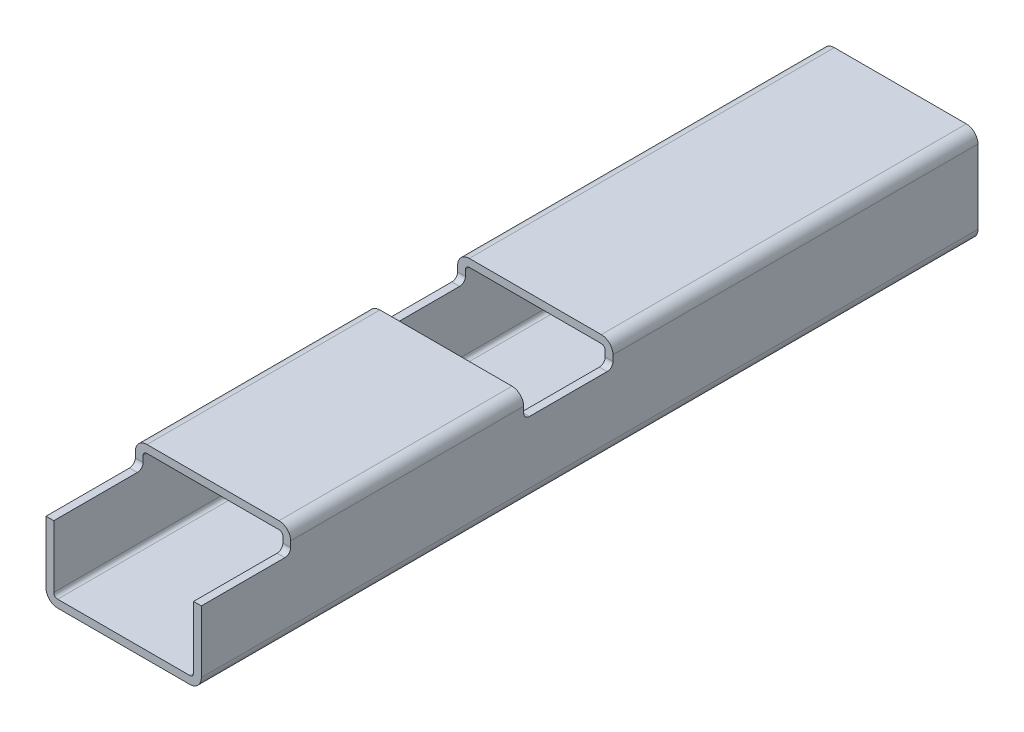
ISO-10303-21;
HEADER;
FILE_DESCRIPTION(('STEP AP214'),'2;1');
FILE_NAME('part.step','',(''),(''),'','','');
FILE_SCHEMA(('AUTOMOTIVE_DESIGN { 1 0 10303 214 1 1 1 1 }'));
ENDSEC;
DATA;
#1=APPLICATION_CONTEXT('core data for automotive mechanical design processes');
#2=APPLICATION_PROTOCOL_DEFINITION('international standard','automotive_design',2000,#1);
#3=PRODUCT_CONTEXT('',#1,'mechanical');
#4=PRODUCT('Part','Part','',(#3));
#5=PRODUCT_RELATED_PRODUCT_CATEGORY('part','',(#4));
#6=PRODUCT_DEFINITION_FORMATION('','',#4);
#7=PRODUCT_DEFINITION_CONTEXT('part definition',#1,'design');
#8=PRODUCT_DEFINITION('design','',#6,#7);
#9=PRODUCT_DEFINITION_SHAPE('','',#8);
#10=(LENGTH_UNIT() NAMED_UNIT(*) SI_UNIT(.MILLI.,.METRE.));
#11=(NAMED_UNIT(*) PLANE_ANGLE_UNIT() SI_UNIT($,.RADIAN.));
#12=(NAMED_UNIT(*) SI_UNIT($,.STERADIAN.) SOLID_ANGLE_UNIT());
#13=UNCERTAINTY_MEASURE_WITH_UNIT(LENGTH_MEASURE(1.E-05),#10,'distance_accuracy_value','');
#14=(GEOMETRIC_REPRESENTATION_CONTEXT(3) GLOBAL_UNCERTAINTY_ASSIGNED_CONTEXT((#13)) GLOBAL_UNIT_ASSIGNED_CONTEXT((#10,
#11,#12)) REPRESENTATION_CONTEXT('',''));
#15=CARTESIAN_POINT('',(0.,0.,0.));
#16=DIRECTION('',(0.,0.,1.));
#17=DIRECTION('',(1.,0.,0.));
#18=AXIS2_PLACEMENT_3D('',#15,#16,#17);
#19=CARTESIAN_POINT('',(34.,19.,400.));
#20=DIRECTION('',(0.,0.,-1.));
#21=DIRECTION('',(-1.,0.,0.));
#22=AXIS2_PLACEMENT_3D('',#19,#20,#21);
#23=CYLINDRICAL_SURFACE('',#22,6.);
#24=DIRECTION('',(0.,0.,-1.));
#25=VECTOR('',#24,1.);
#26=CARTESIAN_POINT('',(34.,25.,400.));
#27=LINE('',#26,#25);
#28=CARTESIAN_POINT('',(34.,25.,188.));
#29=VERTEX_POINT('',#28);
#30=CARTESIAN_POINT('',(34.,25.,0.));
#31=VERTEX_POINT('',#30);
#32=EDGE_CURVE('E339',#29,#31,#27,.T.);
#33=ORIENTED_EDGE('',*,*,#32,.F.);
#34=CARTESIAN_POINT('',(34.,19.,188.));
#35=DIRECTION('',(0.,0.,-1.));
#36=DIRECTION('',(-1.,0.,0.));
#37=AXIS2_PLACEMENT_3D('',#34,#35,#36);
#38=CIRCLE('',#37,6.);
#39=CARTESIAN_POINT('',(40.,19.,188.));
#40=VERTEX_POINT('',#39);
#41=EDGE_CURVE('E520',#29,#40,#38,.T.);
#42=ORIENTED_EDGE('',*,*,#41,.T.);
#43=DIRECTION('',(0.,0.,-1.));
#44=VECTOR('',#43,1.);
#45=CARTESIAN_POINT('',(40.,19.,400.));
#46=LINE('',#45,#44);
#47=CARTESIAN_POINT('',(40.,19.,0.));
#48=VERTEX_POINT('',#47);
#49=EDGE_CURVE('E342',#40,#48,#46,.T.);
#50=ORIENTED_EDGE('',*,*,#49,.T.);
#51=CARTESIAN_POINT('',(34.,19.,0.));
#52=DIRECTION('',(0.,0.,1.));
#53=DIRECTION('',(-1.,0.,0.));
#54=AXIS2_PLACEMENT_3D('',#51,#52,#53);
#55=CIRCLE('',#54,6.);
#56=EDGE_CURVE('E322',#48,#31,#55,.T.);
#57=ORIENTED_EDGE('',*,*,#56,.T.);
#58=EDGE_LOOP('',(#33,#42,#50,#57));
#59=FACE_BOUND('',#58,.T.);
#60=ADVANCED_FACE('F33',(#59),#23,.T.);
#61=CARTESIAN_POINT('',(-34.,25.,400.));
#62=DIRECTION('',(0.,-1.,0.));
#63=DIRECTION('',(0.,0.,-1.));
#64=AXIS2_PLACEMENT_3D('',#61,#62,#63);
#65=PLANE('',#64);
#66=DIRECTION('',(0.,0.,-1.));
#67=VECTOR('',#66,1.);
#68=CARTESIAN_POINT('',(-34.,25.,400.));
#69=LINE('',#68,#67);
#70=CARTESIAN_POINT('',(-34.,25.,188.));
#71=VERTEX_POINT('',#70);
#72=CARTESIAN_POINT('',(-34.,25.,0.));
#73=VERTEX_POINT('',#72);
#74=EDGE_CURVE('E336',#71,#73,#69,.T.);
#75=ORIENTED_EDGE('',*,*,#74,.F.);
#76=DIRECTION('',(1.,0.,0.));
#77=VECTOR('',#76,1.);
#78=CARTESIAN_POINT('',(-40.,25.,188.));
#79=LINE('',#78,#77);
#80=EDGE_CURVE('E461',#71,#29,#79,.T.);
#81=ORIENTED_EDGE('',*,*,#80,.T.);
#82=ORIENTED_EDGE('',*,*,#32,.T.);
#83=DIRECTION('',(-1.,0.,0.));
#84=VECTOR('',#83,1.);
#85=CARTESIAN_POINT('',(-34.,25.,0.));
#86=LINE('',#85,#84);
#87=EDGE_CURVE('E325',#31,#73,#86,.T.);
#88=ORIENTED_EDGE('',*,*,#87,.T.);
#89=EDGE_LOOP('',(#75,#81,#82,#88));
#90=FACE_BOUND('',#89,.T.);
#91=ADVANCED_FACE('F684',(#90),#65,.F.);
#92=CARTESIAN_POINT('',(-34.,19.,400.));
#93=DIRECTION('',(0.,0.,-1.));
#94=DIRECTION('',(-1.,0.,0.));
#95=AXIS2_PLACEMENT_3D('',#92,#93,#94);
#96=CYLINDRICAL_SURFACE('',#95,6.);
#97=DIRECTION('',(0.,0.,-1.));
#98=VECTOR('',#97,1.);
#99=CARTESIAN_POINT('',(-40.,19.,400.));
#100=LINE('',#99,#98);
#101=CARTESIAN_POINT('',(-40.,19.,188.));
#102=VERTEX_POINT('',#101);
#103=CARTESIAN_POINT('',(-40.,19.,0.));
#104=VERTEX_POINT('',#103);
#105=EDGE_CURVE('E305',#102,#104,#100,.T.);
#106=ORIENTED_EDGE('',*,*,#105,.F.);
#107=CARTESIAN_POINT('',(-34.,19.,188.));
#108=DIRECTION('',(0.,0.,-1.));
#109=DIRECTION('',(-1.,0.,0.));
#110=AXIS2_PLACEMENT_3D('',#107,#108,#109);
#111=CIRCLE('',#110,6.);
#112=EDGE_CURVE('E517',#102,#71,#111,.T.);
#113=ORIENTED_EDGE('',*,*,#112,.T.);
#114=ORIENTED_EDGE('',*,*,#74,.T.);
#115=CARTESIAN_POINT('',(-34.,19.,0.));
#116=DIRECTION('',(0.,0.,1.));
#117=DIRECTION('',(-1.,0.,0.));
#118=AXIS2_PLACEMENT_3D('',#115,#116,#117);
#119=CIRCLE('',#118,6.);
#120=EDGE_CURVE('E328',#73,#104,#119,.T.);
#121=ORIENTED_EDGE('',*,*,#120,.T.);
#122=EDGE_LOOP('',(#106,#113,#114,#121));
#123=FACE_BOUND('',#122,.T.);
#124=ADVANCED_FACE('F690',(#123),#96,.T.);
#125=CARTESIAN_POINT('',(34.,19.,400.));
#126=DIRECTION('',(0.,0.,-1.));
#127=DIRECTION('',(-1.,0.,0.));
#128=AXIS2_PLACEMENT_3D('',#125,#126,#127);
#129=CYLINDRICAL_SURFACE('',#128,2.);
#130=CARTESIAN_POINT('',(34.,19.,188.));
#131=DIRECTION('',(0.,0.,-1.));
#132=DIRECTION('',(-1.,0.,0.));
#133=AXIS2_PLACEMENT_3D('',#130,#131,#132);
#134=CIRCLE('',#133,2.);
#135=CARTESIAN_POINT('',(34.,21.,188.));
#136=VERTEX_POINT('',#135);
#137=CARTESIAN_POINT('',(36.,19.,188.));
#138=VERTEX_POINT('',#137);
#139=EDGE_CURVE('E513',#136,#138,#134,.T.);
#140=ORIENTED_EDGE('',*,*,#139,.F.);
#141=DIRECTION('',(0.,0.,-1.));
#142=VECTOR('',#141,1.);
#143=CARTESIAN_POINT('',(34.,21.,400.));
#144=LINE('',#143,#142);
#145=CARTESIAN_POINT('',(34.,21.,0.));
#146=VERTEX_POINT('',#145);
#147=EDGE_CURVE('E398',#136,#146,#144,.T.);
#148=ORIENTED_EDGE('',*,*,#147,.T.);
#149=CARTESIAN_POINT('',(34.,19.,0.));
#150=DIRECTION('',(0.,0.,1.));
#151=DIRECTION('',(-1.,0.,0.));
#152=AXIS2_PLACEMENT_3D('',#149,#150,#151);
#153=CIRCLE('',#152,2.);
#154=CARTESIAN_POINT('',(36.,19.,0.));
#155=VERTEX_POINT('',#154);
#156=EDGE_CURVE('E564',#155,#146,#153,.T.);
#157=ORIENTED_EDGE('',*,*,#156,.F.);
#158=DIRECTION('',(0.,0.,-1.));
#159=VECTOR('',#158,1.);
#160=CARTESIAN_POINT('',(36.,19.,400.));
#161=LINE('',#160,#159);
#162=EDGE_CURVE('E401',#138,#155,#161,.T.);
#163=ORIENTED_EDGE('',*,*,#162,.F.);
#164=EDGE_LOOP('',(#140,#148,#157,#163));
#165=FACE_BOUND('',#164,.T.);
#166=ADVANCED_FACE('F604',(#165),#129,.F.);
#167=CARTESIAN_POINT('',(-34.,21.,400.));
#168=DIRECTION('',(0.,-1.,0.));
#169=DIRECTION('',(1.,0.,0.));
#170=AXIS2_PLACEMENT_3D('',#167,#168,#169);
#171=PLANE('',#170);
#172=DIRECTION('',(1.,0.,0.));
#173=VECTOR('',#172,1.);
#174=CARTESIAN_POINT('',(-34.,21.,188.));
#175=LINE('',#174,#173);
#176=CARTESIAN_POINT('',(-34.,21.,188.));
#177=VERTEX_POINT('',#176);
#178=EDGE_CURVE('E511',#177,#136,#175,.T.);
#179=ORIENTED_EDGE('',*,*,#178,.F.);
#180=DIRECTION('',(0.,0.,-1.));
#181=VECTOR('',#180,1.);
#182=CARTESIAN_POINT('',(-34.,21.,400.));
#183=LINE('',#182,#181);
#184=CARTESIAN_POINT('',(-34.,21.,0.));
#185=VERTEX_POINT('',#184);
#186=EDGE_CURVE('E389',#177,#185,#183,.T.);
#187=ORIENTED_EDGE('',*,*,#186,.T.);
#188=DIRECTION('',(-1.,0.,0.));
#189=VECTOR('',#188,1.);
#190=CARTESIAN_POINT('',(-34.,21.,0.));
#191=LINE('',#190,#189);
#192=EDGE_CURVE('E567',#146,#185,#191,.T.);
#193=ORIENTED_EDGE('',*,*,#192,.F.);
#194=ORIENTED_EDGE('',*,*,#147,.F.);
#195=EDGE_LOOP('',(#179,#187,#193,#194));
#196=FACE_BOUND('',#195,.T.);
#197=ADVANCED_FACE('F609',(#196),#171,.T.);
#198=CARTESIAN_POINT('',(-34.,19.,400.));
#199=DIRECTION('',(0.,0.,-1.));
#200=DIRECTION('',(-1.,0.,0.));
#201=AXIS2_PLACEMENT_3D('',#198,#199,#200);
#202=CYLINDRICAL_SURFACE('',#201,2.);
#203=CARTESIAN_POINT('',(-34.,19.,188.));
#204=DIRECTION('',(0.,0.,-1.));
#205=DIRECTION('',(-1.,0.,0.));
#206=AXIS2_PLACEMENT_3D('',#203,#204,#205);
#207=CIRCLE('',#206,2.);
#208=CARTESIAN_POINT('',(-36.,19.,188.));
#209=VERTEX_POINT('',#208);
#210=EDGE_CURVE('E509',#209,#177,#207,.T.);
#211=ORIENTED_EDGE('',*,*,#210,.F.);
#212=DIRECTION('',(0.,0.,-1.));
#213=VECTOR('',#212,1.);
#214=CARTESIAN_POINT('',(-36.,19.,400.));
#215=LINE('',#214,#213);
#216=CARTESIAN_POINT('',(-36.,19.,0.));
#217=VERTEX_POINT('',#216);
#218=EDGE_CURVE('E390',#209,#217,#215,.T.);
#219=ORIENTED_EDGE('',*,*,#218,.T.);
#220=CARTESIAN_POINT('',(-34.,19.,0.));
#221=DIRECTION('',(0.,0.,1.));
#222=DIRECTION('',(-1.,0.,0.));
#223=AXIS2_PLACEMENT_3D('',#220,#221,#222);
#224=CIRCLE('',#223,2.);
#225=EDGE_CURVE('E570',#185,#217,#224,.T.);
#226=ORIENTED_EDGE('',*,*,#225,.F.);
#227=ORIENTED_EDGE('',*,*,#186,.F.);
#228=EDGE_LOOP('',(#211,#219,#226,#227));
#229=FACE_BOUND('',#228,.T.);
#230=ADVANCED_FACE('F613',(#229),#202,.F.);
#231=CARTESIAN_POINT('',(-34.,-19.,400.));
#232=DIRECTION('',(0.,0.,-1.));
#233=DIRECTION('',(-1.,0.,0.));
#234=AXIS2_PLACEMENT_3D('',#231,#232,#233);
#235=PLANE('',#234);
#236=DIRECTION('',(0.,1.,0.));
#237=VECTOR('',#236,1.);
#238=CARTESIAN_POINT('',(40.,-19.,400.));
#239=LINE('',#238,#237);
#240=CARTESIAN_POINT('',(40.,-19.,400.));
#241=VERTEX_POINT('',#240);
#242=CARTESIAN_POINT('',(40.,13.,400.));
#243=VERTEX_POINT('',#242);
#244=EDGE_CURVE('E303',#241,#243,#239,.T.);
#245=ORIENTED_EDGE('',*,*,#244,.T.);
#246=DIRECTION('',(1.,0.,0.));
#247=VECTOR('',#246,1.);
#248=CARTESIAN_POINT('',(-40.,13.,400.));
#249=LINE('',#248,#247);
#250=CARTESIAN_POINT('',(36.,13.,400.));
#251=VERTEX_POINT('',#250);
#252=EDGE_CURVE('E297',#251,#243,#249,.T.);
#253=ORIENTED_EDGE('',*,*,#252,.F.);
#254=DIRECTION('',(0.,1.,0.));
#255=VECTOR('',#254,1.);
#256=CARTESIAN_POINT('',(36.,-19.,400.));
#257=LINE('',#256,#255);
#258=CARTESIAN_POINT('',(36.,-19.,400.));
#259=VERTEX_POINT('',#258);
#260=EDGE_CURVE('E549',#259,#251,#257,.T.);
#261=ORIENTED_EDGE('',*,*,#260,.F.);
#262=CARTESIAN_POINT('',(34.,-19.,400.));
#263=DIRECTION('',(0.,0.,1.));
#264=DIRECTION('',(1.,0.,0.));
#265=AXIS2_PLACEMENT_3D('',#262,#263,#264);
#266=CIRCLE('',#265,2.);
#267=CARTESIAN_POINT('',(34.,-21.,400.));
#268=VERTEX_POINT('',#267);
#269=EDGE_CURVE('E547',#268,#259,#266,.T.);
#270=ORIENTED_EDGE('',*,*,#269,.F.);
#271=DIRECTION('',(1.,0.,0.));
#272=VECTOR('',#271,1.);
#273=CARTESIAN_POINT('',(-34.,-21.,400.));
#274=LINE('',#273,#272);
#275=CARTESIAN_POINT('',(-34.,-21.,400.));
#276=VERTEX_POINT('',#275);
#277=EDGE_CURVE('E544',#276,#268,#274,.T.);
#278=ORIENTED_EDGE('',*,*,#277,.F.);
#279=CARTESIAN_POINT('',(-34.,-19.,400.));
#280=DIRECTION('',(0.,0.,1.));
#281=DIRECTION('',(-1.,0.,0.));
#282=AXIS2_PLACEMENT_3D('',#279,#280,#281);
#283=CIRCLE('',#282,2.);
#284=CARTESIAN_POINT('',(-36.,-19.,400.));
#285=VERTEX_POINT('',#284);
#286=EDGE_CURVE('E542',#285,#276,#283,.T.);
#287=ORIENTED_EDGE('',*,*,#286,.F.);
#288=DIRECTION('',(0.,-1.,0.));
#289=VECTOR('',#288,1.);
#290=CARTESIAN_POINT('',(-36.,-19.,400.));
#291=LINE('',#290,#289);
#292=CARTESIAN_POINT('',(-36.,13.,400.));
#293=VERTEX_POINT('',#292);
#294=EDGE_CURVE('E295',#293,#285,#291,.T.);
#295=ORIENTED_EDGE('',*,*,#294,.F.);
#296=CARTESIAN_POINT('',(-40.,13.,400.));
#297=VERTEX_POINT('',#296);
#298=EDGE_CURVE('E56',#297,#293,#249,.T.);
#299=ORIENTED_EDGE('',*,*,#298,.F.);
#300=DIRECTION('',(0.,-1.,0.));
#301=VECTOR('',#300,1.);
#302=CARTESIAN_POINT('',(-40.,-19.,400.));
#303=LINE('',#302,#301);
#304=CARTESIAN_POINT('',(-40.,-19.,400.));
#305=VERTEX_POINT('',#304);
#306=EDGE_CURVE('E292',#297,#305,#303,.T.);
#307=ORIENTED_EDGE('',*,*,#306,.T.);
#308=CARTESIAN_POINT('',(-34.,-19.,400.));
#309=DIRECTION('',(0.,0.,1.));
#310=DIRECTION('',(-1.,0.,0.));
#311=AXIS2_PLACEMENT_3D('',#308,#309,#310);
#312=CIRCLE('',#311,6.);
#313=CARTESIAN_POINT('',(-34.,-25.,400.));
#314=VERTEX_POINT('',#313);
#315=EDGE_CURVE('E332',#305,#314,#312,.T.);
#316=ORIENTED_EDGE('',*,*,#315,.T.);
#317=DIRECTION('',(1.,0.,0.));
#318=VECTOR('',#317,1.);
#319=CARTESIAN_POINT('',(-34.,-25.,400.));
#320=LINE('',#319,#318);
#321=CARTESIAN_POINT('',(34.,-25.,400.));
#322=VERTEX_POINT('',#321);
#323=EDGE_CURVE('E411',#314,#322,#320,.T.);
#324=ORIENTED_EDGE('',*,*,#323,.T.);
#325=CARTESIAN_POINT('',(34.,-19.,400.));
#326=DIRECTION('',(0.,0.,1.));
#327=DIRECTION('',(1.,0.,0.));
#328=AXIS2_PLACEMENT_3D('',#325,#326,#327);
#329=CIRCLE('',#328,6.);
#330=EDGE_CURVE('E307',#322,#241,#329,.T.);
#331=ORIENTED_EDGE('',*,*,#330,.T.);
#332=EDGE_LOOP('',(#245,#253,#261,#270,#278,#287,#295,#299,#307,#316,#324,#331));
#333=FACE_BOUND('',#332,.T.);
#334=ADVANCED_FACE('F290',(#333),#235,.F.);
#335=CARTESIAN_POINT('',(-34.,-19.,0.));
#336=DIRECTION('',(0.,0.,-1.));
#337=DIRECTION('',(-1.,0.,0.));
#338=AXIS2_PLACEMENT_3D('',#335,#336,#337);
#339=PLANE('',#338);
#340=CARTESIAN_POINT('',(-34.,-19.,0.));
#341=DIRECTION('',(0.,0.,1.));
#342=DIRECTION('',(-1.,0.,0.));
#343=AXIS2_PLACEMENT_3D('',#340,#341,#342);
#344=CIRCLE('',#343,6.);
#345=CARTESIAN_POINT('',(-40.,-19.,0.));
#346=VERTEX_POINT('',#345);
#347=CARTESIAN_POINT('',(-34.,-25.,0.));
#348=VERTEX_POINT('',#347);
#349=EDGE_CURVE('E311',#346,#348,#344,.T.);
#350=ORIENTED_EDGE('',*,*,#349,.F.);
#351=DIRECTION('',(0.,-1.,0.));
#352=VECTOR('',#351,1.);
#353=CARTESIAN_POINT('',(-40.,-19.,0.));
#354=LINE('',#353,#352);
#355=EDGE_CURVE('E331',#104,#346,#354,.T.);
#356=ORIENTED_EDGE('',*,*,#355,.F.);
#357=ORIENTED_EDGE('',*,*,#120,.F.);
#358=ORIENTED_EDGE('',*,*,#87,.F.);
#359=ORIENTED_EDGE('',*,*,#56,.F.);
#360=DIRECTION('',(0.,1.,0.));
#361=VECTOR('',#360,1.);
#362=CARTESIAN_POINT('',(40.,-19.,0.));
#363=LINE('',#362,#361);
#364=CARTESIAN_POINT('',(40.,-19.,0.));
#365=VERTEX_POINT('',#364);
#366=EDGE_CURVE('E319',#365,#48,#363,.T.);
#367=ORIENTED_EDGE('',*,*,#366,.F.);
#368=CARTESIAN_POINT('',(34.,-19.,0.));
#369=DIRECTION('',(0.,0.,1.));
#370=DIRECTION('',(1.,0.,0.));
#371=AXIS2_PLACEMENT_3D('',#368,#369,#370);
#372=CIRCLE('',#371,6.);
#373=CARTESIAN_POINT('',(34.,-25.,0.));
#374=VERTEX_POINT('',#373);
#375=EDGE_CURVE('E317',#374,#365,#372,.T.);
#376=ORIENTED_EDGE('',*,*,#375,.F.);
#377=DIRECTION('',(1.,0.,0.));
#378=VECTOR('',#377,1.);
#379=CARTESIAN_POINT('',(-34.,-25.,0.));
#380=LINE('',#379,#378);
#381=EDGE_CURVE('E314',#348,#374,#380,.T.);
#382=ORIENTED_EDGE('',*,*,#381,.F.);
#383=EDGE_LOOP('',(#350,#356,#357,#358,#359,#367,#376,#382));
#384=FACE_BOUND('',#383,.T.);
#385=DIRECTION('',(0.,-1.,0.));
#386=VECTOR('',#385,1.);
#387=CARTESIAN_POINT('',(-36.,-19.,0.));
#388=LINE('',#387,#386);
#389=CARTESIAN_POINT('',(-36.,-19.,0.));
#390=VERTEX_POINT('',#389);
#391=EDGE_CURVE('E545',#217,#390,#388,.T.);
#392=ORIENTED_EDGE('',*,*,#391,.T.);
#393=CARTESIAN_POINT('',(-34.,-19.,0.));
#394=DIRECTION('',(0.,0.,1.));
#395=DIRECTION('',(-1.,0.,0.));
#396=AXIS2_PLACEMENT_3D('',#393,#394,#395);
#397=CIRCLE('',#396,2.);
#398=CARTESIAN_POINT('',(-34.,-21.,0.));
#399=VERTEX_POINT('',#398);
#400=EDGE_CURVE('E541',#390,#399,#397,.T.);
#401=ORIENTED_EDGE('',*,*,#400,.T.);
#402=DIRECTION('',(1.,0.,0.));
#403=VECTOR('',#402,1.);
#404=CARTESIAN_POINT('',(-34.,-21.,0.));
#405=LINE('',#404,#403);
#406=CARTESIAN_POINT('',(34.,-21.,0.));
#407=VERTEX_POINT('',#406);
#408=EDGE_CURVE('E555',#399,#407,#405,.T.);
#409=ORIENTED_EDGE('',*,*,#408,.T.);
#410=CARTESIAN_POINT('',(34.,-19.,0.));
#411=DIRECTION('',(0.,0.,1.));
#412=DIRECTION('',(1.,0.,0.));
#413=AXIS2_PLACEMENT_3D('',#410,#411,#412);
#414=CIRCLE('',#413,2.);
#415=CARTESIAN_POINT('',(36.,-19.,0.));
#416=VERTEX_POINT('',#415);
#417=EDGE_CURVE('E558',#407,#416,#414,.T.);
#418=ORIENTED_EDGE('',*,*,#417,.T.);
#419=DIRECTION('',(0.,1.,0.));
#420=VECTOR('',#419,1.);
#421=CARTESIAN_POINT('',(36.,-19.,0.));
#422=LINE('',#421,#420);
#423=EDGE_CURVE('E561',#416,#155,#422,.T.);
#424=ORIENTED_EDGE('',*,*,#423,.T.);
#425=ORIENTED_EDGE('',*,*,#156,.T.);
#426=ORIENTED_EDGE('',*,*,#192,.T.);
#427=ORIENTED_EDGE('',*,*,#225,.T.);
#428=EDGE_LOOP('',(#392,#401,#409,#418,#424,#425,#426,#427));
#429=FACE_BOUND('',#428,.T.);
#430=ADVANCED_FACE('F575',(#384,#429),#339,.T.);
#431=CARTESIAN_POINT('',(-34.,-19.,400.));
#432=DIRECTION('',(0.,0.,-1.));
#433=DIRECTION('',(-1.,0.,0.));
#434=AXIS2_PLACEMENT_3D('',#431,#432,#433);
#435=CYLINDRICAL_SURFACE('',#434,6.);
#436=ORIENTED_EDGE('',*,*,#349,.T.);
#437=DIRECTION('',(0.,0.,-1.));
#438=VECTOR('',#437,1.);
#439=CARTESIAN_POINT('',(-34.,-25.,400.));
#440=LINE('',#439,#438);
#441=EDGE_CURVE('E351',#314,#348,#440,.T.);
#442=ORIENTED_EDGE('',*,*,#441,.F.);
#443=ORIENTED_EDGE('',*,*,#315,.F.);
#444=DIRECTION('',(0.,0.,-1.));
#445=VECTOR('',#444,1.);
#446=CARTESIAN_POINT('',(-40.,-19.,400.));
#447=LINE('',#446,#445);
#448=EDGE_CURVE('E301',#305,#346,#447,.T.);
#449=ORIENTED_EDGE('',*,*,#448,.T.);
#450=EDGE_LOOP('',(#436,#442,#443,#449));
#451=FACE_BOUND('',#450,.T.);
#452=ADVANCED_FACE('F35',(#451),#435,.T.);
#453=CARTESIAN_POINT('',(-34.,-25.,400.));
#454=DIRECTION('',(0.,1.,0.));
#455=DIRECTION('',(0.,0.,1.));
#456=AXIS2_PLACEMENT_3D('',#453,#454,#455);
#457=PLANE('',#456);
#458=ORIENTED_EDGE('',*,*,#381,.T.);
#459=DIRECTION('',(0.,0.,-1.));
#460=VECTOR('',#459,1.);
#461=CARTESIAN_POINT('',(34.,-25.,400.));
#462=LINE('',#461,#460);
#463=EDGE_CURVE('E348',#322,#374,#462,.T.);
#464=ORIENTED_EDGE('',*,*,#463,.F.);
#465=ORIENTED_EDGE('',*,*,#323,.F.);
#466=ORIENTED_EDGE('',*,*,#441,.T.);
#467=EDGE_LOOP('',(#458,#464,#465,#466));
#468=FACE_BOUND('',#467,.T.);
#469=ADVANCED_FACE('F703',(#468),#457,.F.);
#470=CARTESIAN_POINT('',(34.,-19.,400.));
#471=DIRECTION('',(0.,0.,-1.));
#472=DIRECTION('',(-1.,0.,0.));
#473=AXIS2_PLACEMENT_3D('',#470,#471,#472);
#474=CYLINDRICAL_SURFACE('',#473,6.);
#475=ORIENTED_EDGE('',*,*,#375,.T.);
#476=DIRECTION('',(0.,0.,-1.));
#477=VECTOR('',#476,1.);
#478=CARTESIAN_POINT('',(40.,-19.,400.));
#479=LINE('',#478,#477);
#480=EDGE_CURVE('E345',#241,#365,#479,.T.);
#481=ORIENTED_EDGE('',*,*,#480,.F.);
#482=ORIENTED_EDGE('',*,*,#330,.F.);
#483=ORIENTED_EDGE('',*,*,#463,.T.);
#484=EDGE_LOOP('',(#475,#481,#482,#483));
#485=FACE_BOUND('',#484,.T.);
#486=ADVANCED_FACE('F418',(#485),#474,.T.);
#487=CARTESIAN_POINT('',(40.,-19.,400.));
#488=DIRECTION('',(-1.,0.,0.));
#489=DIRECTION('',(0.,0.,1.));
#490=AXIS2_PLACEMENT_3D('',#487,#488,#489);
#491=PLANE('',#490);
#492=CARTESIAN_POINT('',(40.,19.,354.));
#493=VERTEX_POINT('',#492);
#494=CARTESIAN_POINT('',(40.,19.,234.));
#495=VERTEX_POINT('',#494);
#496=EDGE_CURVE('E344',#493,#495,#46,.T.);
#497=ORIENTED_EDGE('',*,*,#496,.F.);
#498=DIRECTION('',(0.,1.,0.));
#499=VECTOR('',#498,1.);
#500=CARTESIAN_POINT('',(40.,16.,354.));
#501=LINE('',#500,#499);
#502=CARTESIAN_POINT('',(40.,16.,354.));
#503=VERTEX_POINT('',#502);
#504=EDGE_CURVE('E285',#503,#493,#501,.T.);
#505=ORIENTED_EDGE('',*,*,#504,.F.);
#506=CARTESIAN_POINT('',(40.,16.,357.));
#507=DIRECTION('',(1.,0.,0.));
#508=DIRECTION('',(0.,0.,-1.));
#509=AXIS2_PLACEMENT_3D('',#506,#507,#508);
#510=CIRCLE('',#509,3.);
#511=CARTESIAN_POINT('',(40.,13.,357.));
#512=VERTEX_POINT('',#511);
#513=EDGE_CURVE('E430',#512,#503,#510,.T.);
#514=ORIENTED_EDGE('',*,*,#513,.F.);
#515=DIRECTION('',(0.,0.,-1.));
#516=VECTOR('',#515,1.);
#517=CARTESIAN_POINT('',(40.,13.,400.));
#518=LINE('',#517,#516);
#519=EDGE_CURVE('E427',#243,#512,#518,.T.);
#520=ORIENTED_EDGE('',*,*,#519,.F.);
#521=ORIENTED_EDGE('',*,*,#244,.F.);
#522=ORIENTED_EDGE('',*,*,#480,.T.);
#523=ORIENTED_EDGE('',*,*,#366,.T.);
#524=ORIENTED_EDGE('',*,*,#49,.F.);
#525=DIRECTION('',(0.,1.,0.));
#526=VECTOR('',#525,1.);
#527=CARTESIAN_POINT('',(40.,16.,188.));
#528=LINE('',#527,#526);
#529=CARTESIAN_POINT('',(40.,16.,188.));
#530=VERTEX_POINT('',#529);
#531=EDGE_CURVE('E462',#530,#40,#528,.T.);
#532=ORIENTED_EDGE('',*,*,#531,.F.);
#533=CARTESIAN_POINT('',(40.,16.,191.));
#534=DIRECTION('',(1.,0.,0.));
#535=DIRECTION('',(0.,0.,-1.));
#536=AXIS2_PLACEMENT_3D('',#533,#534,#535);
#537=CIRCLE('',#536,3.);
#538=CARTESIAN_POINT('',(40.,13.,191.));
#539=VERTEX_POINT('',#538);
#540=EDGE_CURVE('E451',#539,#530,#537,.T.);
#541=ORIENTED_EDGE('',*,*,#540,.F.);
#542=DIRECTION('',(0.,0.,-1.));
#543=VECTOR('',#542,1.);
#544=CARTESIAN_POINT('',(40.,13.,231.));
#545=LINE('',#544,#543);
#546=CARTESIAN_POINT('',(40.,13.,231.));
#547=VERTEX_POINT('',#546);
#548=EDGE_CURVE('E470',#547,#539,#545,.T.);
#549=ORIENTED_EDGE('',*,*,#548,.F.);
#550=CARTESIAN_POINT('',(40.,16.,231.));
#551=DIRECTION('',(1.,0.,0.));
#552=DIRECTION('',(0.,0.,1.));
#553=AXIS2_PLACEMENT_3D('',#550,#551,#552);
#554=CIRCLE('',#553,3.);
#555=CARTESIAN_POINT('',(40.,16.,234.));
#556=VERTEX_POINT('',#555);
#557=EDGE_CURVE('E467',#556,#547,#554,.T.);
#558=ORIENTED_EDGE('',*,*,#557,.F.);
#559=DIRECTION('',(0.,-1.,0.));
#560=VECTOR('',#559,1.);
#561=CARTESIAN_POINT('',(40.,16.,234.));
#562=LINE('',#561,#560);
#563=EDGE_CURVE('E464',#495,#556,#562,.T.);
#564=ORIENTED_EDGE('',*,*,#563,.F.);
#565=EDGE_LOOP('',(#497,#505,#514,#520,#521,#522,#523,#524,#532,#541,#549,#558,#564));
#566=FACE_BOUND('',#565,.T.);
#567=ADVANCED_FACE('F424',(#566),#491,.F.);
#568=CARTESIAN_POINT('',(34.,25.,354.));
#569=VERTEX_POINT('',#568);
#570=CARTESIAN_POINT('',(34.,25.,234.));
#571=VERTEX_POINT('',#570);
#572=EDGE_CURVE('E341',#569,#571,#27,.T.);
#573=ORIENTED_EDGE('',*,*,#572,.F.);
#574=CARTESIAN_POINT('',(34.,19.,354.));
#575=DIRECTION('',(0.,0.,-1.));
#576=DIRECTION('',(-1.,0.,0.));
#577=AXIS2_PLACEMENT_3D('',#574,#575,#576);
#578=CIRCLE('',#577,6.);
#579=EDGE_CURVE('E538',#569,#493,#578,.T.);
#580=ORIENTED_EDGE('',*,*,#579,.T.);
#581=ORIENTED_EDGE('',*,*,#496,.T.);
#582=CARTESIAN_POINT('',(34.,19.,234.));
#583=DIRECTION('',(0.,0.,1.));
#584=DIRECTION('',(1.,0.,0.));
#585=AXIS2_PLACEMENT_3D('',#582,#583,#584);
#586=CIRCLE('',#585,6.);
#587=EDGE_CURVE('E500',#495,#571,#586,.T.);
#588=ORIENTED_EDGE('',*,*,#587,.T.);
#589=EDGE_LOOP('',(#573,#580,#581,#588));
#590=FACE_BOUND('',#589,.T.);
#591=ADVANCED_FACE('F640',(#590),#23,.T.);
#592=CARTESIAN_POINT('',(-34.,25.,354.));
#593=VERTEX_POINT('',#592);
#594=CARTESIAN_POINT('',(-34.,25.,234.));
#595=VERTEX_POINT('',#594);
#596=EDGE_CURVE('E338',#593,#595,#69,.T.);
#597=ORIENTED_EDGE('',*,*,#596,.F.);
#598=DIRECTION('',(1.,0.,0.));
#599=VECTOR('',#598,1.);
#600=CARTESIAN_POINT('',(-40.,25.,354.));
#601=LINE('',#600,#599);
#602=EDGE_CURVE('E378',#593,#569,#601,.T.);
#603=ORIENTED_EDGE('',*,*,#602,.T.);
#604=ORIENTED_EDGE('',*,*,#572,.T.);
#605=DIRECTION('',(1.,0.,0.));
#606=VECTOR('',#605,1.);
#607=CARTESIAN_POINT('',(-40.,25.,234.));
#608=LINE('',#607,#606);
#609=EDGE_CURVE('E486',#595,#571,#608,.T.);
#610=ORIENTED_EDGE('',*,*,#609,.F.);
#611=EDGE_LOOP('',(#597,#603,#604,#610));
#612=FACE_BOUND('',#611,.T.);
#613=ADVANCED_FACE('F637',(#612),#65,.F.);
#614=CARTESIAN_POINT('',(-40.,19.,354.));
#615=VERTEX_POINT('',#614);
#616=CARTESIAN_POINT('',(-40.,19.,234.));
#617=VERTEX_POINT('',#616);
#618=EDGE_CURVE('E335',#615,#617,#100,.T.);
#619=ORIENTED_EDGE('',*,*,#618,.F.);
#620=CARTESIAN_POINT('',(-34.,19.,354.));
#621=DIRECTION('',(0.,0.,-1.));
#622=DIRECTION('',(-1.,0.,0.));
#623=AXIS2_PLACEMENT_3D('',#620,#621,#622);
#624=CIRCLE('',#623,6.);
#625=EDGE_CURVE('E535',#615,#593,#624,.T.);
#626=ORIENTED_EDGE('',*,*,#625,.T.);
#627=ORIENTED_EDGE('',*,*,#596,.T.);
#628=CARTESIAN_POINT('',(-34.,19.,234.));
#629=DIRECTION('',(0.,0.,1.));
#630=DIRECTION('',(1.,0.,0.));
#631=AXIS2_PLACEMENT_3D('',#628,#629,#630);
#632=CIRCLE('',#631,6.);
#633=EDGE_CURVE('E497',#595,#617,#632,.T.);
#634=ORIENTED_EDGE('',*,*,#633,.T.);
#635=EDGE_LOOP('',(#619,#626,#627,#634));
#636=FACE_BOUND('',#635,.T.);
#637=ADVANCED_FACE('F631',(#636),#96,.T.);
#638=CARTESIAN_POINT('',(-40.,-19.,400.));
#639=DIRECTION('',(1.,0.,0.));
#640=DIRECTION('',(0.,0.,-1.));
#641=AXIS2_PLACEMENT_3D('',#638,#639,#640);
#642=PLANE('',#641);
#643=CARTESIAN_POINT('',(-40.,16.,357.));
#644=DIRECTION('',(1.,0.,0.));
#645=DIRECTION('',(0.,0.,-1.));
#646=AXIS2_PLACEMENT_3D('',#643,#644,#645);
#647=CIRCLE('',#646,3.);
#648=CARTESIAN_POINT('',(-40.,13.,357.));
#649=VERTEX_POINT('',#648);
#650=CARTESIAN_POINT('',(-40.,16.,354.));
#651=VERTEX_POINT('',#650);
#652=EDGE_CURVE('E284',#649,#651,#647,.T.);
#653=ORIENTED_EDGE('',*,*,#652,.T.);
#654=DIRECTION('',(0.,1.,0.));
#655=VECTOR('',#654,1.);
#656=CARTESIAN_POINT('',(-40.,16.,354.));
#657=LINE('',#656,#655);
#658=EDGE_CURVE('E377',#651,#615,#657,.T.);
#659=ORIENTED_EDGE('',*,*,#658,.T.);
#660=ORIENTED_EDGE('',*,*,#618,.T.);
#661=DIRECTION('',(0.,-1.,0.));
#662=VECTOR('',#661,1.);
#663=CARTESIAN_POINT('',(-40.,16.,234.));
#664=LINE('',#663,#662);
#665=CARTESIAN_POINT('',(-40.,16.,234.));
#666=VERTEX_POINT('',#665);
#667=EDGE_CURVE('E450',#617,#666,#664,.T.);
#668=ORIENTED_EDGE('',*,*,#667,.T.);
#669=CARTESIAN_POINT('',(-40.,16.,231.));
#670=DIRECTION('',(1.,0.,0.));
#671=DIRECTION('',(0.,0.,1.));
#672=AXIS2_PLACEMENT_3D('',#669,#670,#671);
#673=CIRCLE('',#672,3.);
#674=CARTESIAN_POINT('',(-40.,13.,231.));
#675=VERTEX_POINT('',#674);
#676=EDGE_CURVE('E48',#666,#675,#673,.T.);
#677=ORIENTED_EDGE('',*,*,#676,.T.);
#678=DIRECTION('',(0.,0.,-1.));
#679=VECTOR('',#678,1.);
#680=CARTESIAN_POINT('',(-40.,13.,231.));
#681=LINE('',#680,#679);
#682=CARTESIAN_POINT('',(-40.,13.,191.));
#683=VERTEX_POINT('',#682);
#684=EDGE_CURVE('E455',#675,#683,#681,.T.);
#685=ORIENTED_EDGE('',*,*,#684,.T.);
#686=CARTESIAN_POINT('',(-40.,16.,191.));
#687=DIRECTION('',(1.,0.,0.));
#688=DIRECTION('',(0.,0.,-1.));
#689=AXIS2_PLACEMENT_3D('',#686,#687,#688);
#690=CIRCLE('',#689,3.);
#691=CARTESIAN_POINT('',(-40.,16.,188.));
#692=VERTEX_POINT('',#691);
#693=EDGE_CURVE('E458',#683,#692,#690,.T.);
#694=ORIENTED_EDGE('',*,*,#693,.T.);
#695=DIRECTION('',(0.,1.,0.));
#696=VECTOR('',#695,1.);
#697=CARTESIAN_POINT('',(-40.,16.,188.));
#698=LINE('',#697,#696);
#699=EDGE_CURVE('E447',#692,#102,#698,.T.);
#700=ORIENTED_EDGE('',*,*,#699,.T.);
#701=ORIENTED_EDGE('',*,*,#105,.T.);
#702=ORIENTED_EDGE('',*,*,#355,.T.);
#703=ORIENTED_EDGE('',*,*,#448,.F.);
#704=ORIENTED_EDGE('',*,*,#306,.F.);
#705=DIRECTION('',(0.,0.,-1.));
#706=VECTOR('',#705,1.);
#707=CARTESIAN_POINT('',(-40.,13.,400.));
#708=LINE('',#707,#706);
#709=EDGE_CURVE('E276',#297,#649,#708,.T.);
#710=ORIENTED_EDGE('',*,*,#709,.T.);
#711=EDGE_LOOP('',(#653,#659,#660,#668,#677,#685,#694,#700,#701,#702,#703,#704,#710));
#712=FACE_BOUND('',#711,.T.);
#713=ADVANCED_FACE('F299',(#712),#642,.F.);
#714=CARTESIAN_POINT('',(-34.,-19.,400.));
#715=DIRECTION('',(0.,0.,-1.));
#716=DIRECTION('',(-1.,0.,0.));
#717=AXIS2_PLACEMENT_3D('',#714,#715,#716);
#718=CYLINDRICAL_SURFACE('',#717,2.);
#719=ORIENTED_EDGE('',*,*,#400,.F.);
#720=DIRECTION('',(0.,0.,-1.));
#721=VECTOR('',#720,1.);
#722=CARTESIAN_POINT('',(-36.,-19.,400.));
#723=LINE('',#722,#721);
#724=EDGE_CURVE('E394',#285,#390,#723,.T.);
#725=ORIENTED_EDGE('',*,*,#724,.F.);
#726=ORIENTED_EDGE('',*,*,#286,.T.);
#727=DIRECTION('',(0.,0.,-1.));
#728=VECTOR('',#727,1.);
#729=CARTESIAN_POINT('',(-34.,-21.,400.));
#730=LINE('',#729,#728);
#731=EDGE_CURVE('E315',#276,#399,#730,.T.);
#732=ORIENTED_EDGE('',*,*,#731,.T.);
#733=EDGE_LOOP('',(#719,#725,#726,#732));
#734=FACE_BOUND('',#733,.T.);
#735=ADVANCED_FACE('F582',(#734),#718,.F.);
#736=CARTESIAN_POINT('',(-34.,-21.,400.));
#737=DIRECTION('',(0.,1.,0.));
#738=DIRECTION('',(0.,0.,1.));
#739=AXIS2_PLACEMENT_3D('',#736,#737,#738);
#740=PLANE('',#739);
#741=ORIENTED_EDGE('',*,*,#408,.F.);
#742=ORIENTED_EDGE('',*,*,#731,.F.);
#743=ORIENTED_EDGE('',*,*,#277,.T.);
#744=DIRECTION('',(0.,0.,-1.));
#745=VECTOR('',#744,1.);
#746=CARTESIAN_POINT('',(34.,-21.,400.));
#747=LINE('',#746,#745);
#748=EDGE_CURVE('E406',#268,#407,#747,.T.);
#749=ORIENTED_EDGE('',*,*,#748,.T.);
#750=EDGE_LOOP('',(#741,#742,#743,#749));
#751=FACE_BOUND('',#750,.T.);
#752=ADVANCED_FACE('F589',(#751),#740,.T.);
#753=CARTESIAN_POINT('',(34.,-19.,400.));
#754=DIRECTION('',(0.,0.,-1.));
#755=DIRECTION('',(-1.,0.,0.));
#756=AXIS2_PLACEMENT_3D('',#753,#754,#755);
#757=CYLINDRICAL_SURFACE('',#756,2.);
#758=ORIENTED_EDGE('',*,*,#417,.F.);
#759=ORIENTED_EDGE('',*,*,#748,.F.);
#760=ORIENTED_EDGE('',*,*,#269,.T.);
#761=DIRECTION('',(0.,0.,-1.));
#762=VECTOR('',#761,1.);
#763=CARTESIAN_POINT('',(36.,-19.,400.));
#764=LINE('',#763,#762);
#765=EDGE_CURVE('E404',#259,#416,#764,.T.);
#766=ORIENTED_EDGE('',*,*,#765,.T.);
#767=EDGE_LOOP('',(#758,#759,#760,#766));
#768=FACE_BOUND('',#767,.T.);
#769=ADVANCED_FACE('F592',(#768),#757,.F.);
#770=CARTESIAN_POINT('',(36.,-19.,400.));
#771=DIRECTION('',(-1.,0.,0.));
#772=DIRECTION('',(0.,0.,1.));
#773=AXIS2_PLACEMENT_3D('',#770,#771,#772);
#774=PLANE('',#773);
#775=DIRECTION('',(0.,-1.,0.));
#776=VECTOR('',#775,1.);
#777=CARTESIAN_POINT('',(36.,-19.,354.));
#778=LINE('',#777,#776);
#779=CARTESIAN_POINT('',(36.,19.,354.));
#780=VERTEX_POINT('',#779);
#781=CARTESIAN_POINT('',(36.,16.,354.));
#782=VERTEX_POINT('',#781);
#783=EDGE_CURVE('E533',#780,#782,#778,.T.);
#784=ORIENTED_EDGE('',*,*,#783,.F.);
#785=CARTESIAN_POINT('',(36.,19.,234.));
#786=VERTEX_POINT('',#785);
#787=EDGE_CURVE('E403',#780,#786,#161,.T.);
#788=ORIENTED_EDGE('',*,*,#787,.T.);
#789=DIRECTION('',(0.,1.,0.));
#790=VECTOR('',#789,1.);
#791=CARTESIAN_POINT('',(36.,-19.,234.));
#792=LINE('',#791,#790);
#793=CARTESIAN_POINT('',(36.,16.,234.));
#794=VERTEX_POINT('',#793);
#795=EDGE_CURVE('E495',#794,#786,#792,.T.);
#796=ORIENTED_EDGE('',*,*,#795,.F.);
#797=CARTESIAN_POINT('',(36.,16.,231.));
#798=DIRECTION('',(-1.,0.,0.));
#799=DIRECTION('',(0.,0.,1.));
#800=AXIS2_PLACEMENT_3D('',#797,#798,#799);
#801=CIRCLE('',#800,3.);
#802=CARTESIAN_POINT('',(36.,13.,231.));
#803=VERTEX_POINT('',#802);
#804=EDGE_CURVE('E503',#803,#794,#801,.T.);
#805=ORIENTED_EDGE('',*,*,#804,.F.);
#806=DIRECTION('',(0.,0.,1.));
#807=VECTOR('',#806,1.);
#808=CARTESIAN_POINT('',(36.,13.,400.));
#809=LINE('',#808,#807);
#810=CARTESIAN_POINT('',(36.,13.,191.));
#811=VERTEX_POINT('',#810);
#812=EDGE_CURVE('E505',#811,#803,#809,.T.);
#813=ORIENTED_EDGE('',*,*,#812,.F.);
#814=CARTESIAN_POINT('',(36.,16.,191.));
#815=DIRECTION('',(-1.,0.,0.));
#816=DIRECTION('',(0.,0.,1.));
#817=AXIS2_PLACEMENT_3D('',#814,#815,#816);
#818=CIRCLE('',#817,3.);
#819=CARTESIAN_POINT('',(36.,16.,188.));
#820=VERTEX_POINT('',#819);
#821=EDGE_CURVE('E507',#820,#811,#818,.T.);
#822=ORIENTED_EDGE('',*,*,#821,.F.);
#823=DIRECTION('',(0.,-1.,0.));
#824=VECTOR('',#823,1.);
#825=CARTESIAN_POINT('',(36.,-19.,188.));
#826=LINE('',#825,#824);
#827=EDGE_CURVE('E515',#138,#820,#826,.T.);
#828=ORIENTED_EDGE('',*,*,#827,.F.);
#829=ORIENTED_EDGE('',*,*,#162,.T.);
#830=ORIENTED_EDGE('',*,*,#423,.F.);
#831=ORIENTED_EDGE('',*,*,#765,.F.);
#832=ORIENTED_EDGE('',*,*,#260,.T.);
#833=DIRECTION('',(0.,0.,1.));
#834=VECTOR('',#833,1.);
#835=CARTESIAN_POINT('',(36.,13.,400.));
#836=LINE('',#835,#834);
#837=CARTESIAN_POINT('',(36.,13.,357.));
#838=VERTEX_POINT('',#837);
#839=EDGE_CURVE('E523',#838,#251,#836,.T.);
#840=ORIENTED_EDGE('',*,*,#839,.F.);
#841=CARTESIAN_POINT('',(36.,16.,357.));
#842=DIRECTION('',(-1.,0.,0.));
#843=DIRECTION('',(0.,0.,1.));
#844=AXIS2_PLACEMENT_3D('',#841,#842,#843);
#845=CIRCLE('',#844,3.);
#846=EDGE_CURVE('E525',#782,#838,#845,.T.);
#847=ORIENTED_EDGE('',*,*,#846,.F.);
#848=EDGE_LOOP('',(#784,#788,#796,#805,#813,#822,#828,#829,#830,#831,#832,#840,#847));
#849=FACE_BOUND('',#848,.T.);
#850=ADVANCED_FACE('F598',(#849),#774,.T.);
#851=CARTESIAN_POINT('',(34.,19.,354.));
#852=DIRECTION('',(0.,0.,-1.));
#853=DIRECTION('',(-1.,0.,0.));
#854=AXIS2_PLACEMENT_3D('',#851,#852,#853);
#855=CIRCLE('',#854,2.);
#856=CARTESIAN_POINT('',(34.,21.,354.));
#857=VERTEX_POINT('',#856);
#858=EDGE_CURVE('E531',#857,#780,#855,.T.);
#859=ORIENTED_EDGE('',*,*,#858,.F.);
#860=CARTESIAN_POINT('',(34.,21.,234.));
#861=VERTEX_POINT('',#860);
#862=EDGE_CURVE('E400',#857,#861,#144,.T.);
#863=ORIENTED_EDGE('',*,*,#862,.T.);
#864=CARTESIAN_POINT('',(34.,19.,234.));
#865=DIRECTION('',(0.,0.,1.));
#866=DIRECTION('',(1.,0.,0.));
#867=AXIS2_PLACEMENT_3D('',#864,#865,#866);
#868=CIRCLE('',#867,2.);
#869=EDGE_CURVE('E493',#786,#861,#868,.T.);
#870=ORIENTED_EDGE('',*,*,#869,.F.);
#871=ORIENTED_EDGE('',*,*,#787,.F.);
#872=EDGE_LOOP('',(#859,#863,#870,#871));
#873=FACE_BOUND('',#872,.T.);
#874=ADVANCED_FACE('F659',(#873),#129,.F.);
#875=DIRECTION('',(1.,0.,0.));
#876=VECTOR('',#875,1.);
#877=CARTESIAN_POINT('',(-34.,21.,354.));
#878=LINE('',#877,#876);
#879=CARTESIAN_POINT('',(-34.,21.,354.));
#880=VERTEX_POINT('',#879);
#881=EDGE_CURVE('E529',#880,#857,#878,.T.);
#882=ORIENTED_EDGE('',*,*,#881,.F.);
#883=CARTESIAN_POINT('',(-34.,21.,234.));
#884=VERTEX_POINT('',#883);
#885=EDGE_CURVE('E392',#880,#884,#183,.T.);
#886=ORIENTED_EDGE('',*,*,#885,.T.);
#887=DIRECTION('',(-1.,0.,0.));
#888=VECTOR('',#887,1.);
#889=CARTESIAN_POINT('',(-34.,21.,234.));
#890=LINE('',#889,#888);
#891=EDGE_CURVE('E491',#861,#884,#890,.T.);
#892=ORIENTED_EDGE('',*,*,#891,.F.);
#893=ORIENTED_EDGE('',*,*,#862,.F.);
#894=EDGE_LOOP('',(#882,#886,#892,#893));
#895=FACE_BOUND('',#894,.T.);
#896=ADVANCED_FACE('F666',(#895),#171,.T.);
#897=CARTESIAN_POINT('',(-34.,19.,354.));
#898=DIRECTION('',(0.,0.,-1.));
#899=DIRECTION('',(-1.,0.,0.));
#900=AXIS2_PLACEMENT_3D('',#897,#898,#899);
#901=CIRCLE('',#900,2.);
#902=CARTESIAN_POINT('',(-36.,19.,354.));
#903=VERTEX_POINT('',#902);
#904=EDGE_CURVE('E527',#903,#880,#901,.T.);
#905=ORIENTED_EDGE('',*,*,#904,.F.);
#906=CARTESIAN_POINT('',(-36.,19.,234.));
#907=VERTEX_POINT('',#906);
#908=EDGE_CURVE('E385',#903,#907,#215,.T.);
#909=ORIENTED_EDGE('',*,*,#908,.T.);
#910=CARTESIAN_POINT('',(-34.,19.,234.));
#911=DIRECTION('',(0.,0.,1.));
#912=DIRECTION('',(1.,0.,0.));
#913=AXIS2_PLACEMENT_3D('',#910,#911,#912);
#914=CIRCLE('',#913,2.);
#915=EDGE_CURVE('E444',#884,#907,#914,.T.);
#916=ORIENTED_EDGE('',*,*,#915,.F.);
#917=ORIENTED_EDGE('',*,*,#885,.F.);
#918=EDGE_LOOP('',(#905,#909,#916,#917));
#919=FACE_BOUND('',#918,.T.);
#920=ADVANCED_FACE('F668',(#919),#202,.F.);
#921=CARTESIAN_POINT('',(-36.,-19.,400.));
#922=DIRECTION('',(1.,0.,0.));
#923=DIRECTION('',(0.,0.,-1.));
#924=AXIS2_PLACEMENT_3D('',#921,#922,#923);
#925=PLANE('',#924);
#926=DIRECTION('',(0.,1.,0.));
#927=VECTOR('',#926,1.);
#928=CARTESIAN_POINT('',(-36.,-19.,354.));
#929=LINE('',#928,#927);
#930=CARTESIAN_POINT('',(-36.,16.,354.));
#931=VERTEX_POINT('',#930);
#932=EDGE_CURVE('E11',#931,#903,#929,.T.);
#933=ORIENTED_EDGE('',*,*,#932,.F.);
#934=CARTESIAN_POINT('',(-36.,16.,357.));
#935=DIRECTION('',(1.,0.,0.));
#936=DIRECTION('',(0.,0.,-1.));
#937=AXIS2_PLACEMENT_3D('',#934,#935,#936);
#938=CIRCLE('',#937,3.);
#939=CARTESIAN_POINT('',(-36.,13.,357.));
#940=VERTEX_POINT('',#939);
#941=EDGE_CURVE('E41',#940,#931,#938,.T.);
#942=ORIENTED_EDGE('',*,*,#941,.F.);
#943=DIRECTION('',(0.,0.,-1.));
#944=VECTOR('',#943,1.);
#945=CARTESIAN_POINT('',(-36.,13.,400.));
#946=LINE('',#945,#944);
#947=EDGE_CURVE('E364',#293,#940,#946,.T.);
#948=ORIENTED_EDGE('',*,*,#947,.F.);
#949=ORIENTED_EDGE('',*,*,#294,.T.);
#950=ORIENTED_EDGE('',*,*,#724,.T.);
#951=ORIENTED_EDGE('',*,*,#391,.F.);
#952=ORIENTED_EDGE('',*,*,#218,.F.);
#953=DIRECTION('',(0.,1.,0.));
#954=VECTOR('',#953,1.);
#955=CARTESIAN_POINT('',(-36.,-19.,188.));
#956=LINE('',#955,#954);
#957=CARTESIAN_POINT('',(-36.,16.,188.));
#958=VERTEX_POINT('',#957);
#959=EDGE_CURVE('E362',#958,#209,#956,.T.);
#960=ORIENTED_EDGE('',*,*,#959,.F.);
#961=CARTESIAN_POINT('',(-36.,16.,191.));
#962=DIRECTION('',(1.,0.,0.));
#963=DIRECTION('',(0.,0.,-1.));
#964=AXIS2_PLACEMENT_3D('',#961,#962,#963);
#965=CIRCLE('',#964,3.);
#966=CARTESIAN_POINT('',(-36.,13.,191.));
#967=VERTEX_POINT('',#966);
#968=EDGE_CURVE('E360',#967,#958,#965,.T.);
#969=ORIENTED_EDGE('',*,*,#968,.F.);
#970=DIRECTION('',(0.,0.,-1.));
#971=VECTOR('',#970,1.);
#972=CARTESIAN_POINT('',(-36.,13.,400.));
#973=LINE('',#972,#971);
#974=CARTESIAN_POINT('',(-36.,13.,231.));
#975=VERTEX_POINT('',#974);
#976=EDGE_CURVE('E358',#975,#967,#973,.T.);
#977=ORIENTED_EDGE('',*,*,#976,.F.);
#978=CARTESIAN_POINT('',(-36.,16.,231.));
#979=DIRECTION('',(1.,0.,0.));
#980=DIRECTION('',(0.,0.,-1.));
#981=AXIS2_PLACEMENT_3D('',#978,#979,#980);
#982=CIRCLE('',#981,3.);
#983=CARTESIAN_POINT('',(-36.,16.,234.));
#984=VERTEX_POINT('',#983);
#985=EDGE_CURVE('E356',#984,#975,#982,.T.);
#986=ORIENTED_EDGE('',*,*,#985,.F.);
#987=DIRECTION('',(0.,-1.,0.));
#988=VECTOR('',#987,1.);
#989=CARTESIAN_POINT('',(-36.,-19.,234.));
#990=LINE('',#989,#988);
#991=EDGE_CURVE('E354',#907,#984,#990,.T.);
#992=ORIENTED_EDGE('',*,*,#991,.F.);
#993=ORIENTED_EDGE('',*,*,#908,.F.);
#994=EDGE_LOOP('',(#933,#942,#948,#949,#950,#951,#952,#960,#969,#977,#986,#992,#993));
#995=FACE_BOUND('',#994,.T.);
#996=ADVANCED_FACE('F382',(#995),#925,.T.);
#997=CARTESIAN_POINT('',(-40.,16.,188.));
#998=DIRECTION('',(0.,0.,-1.));
#999=DIRECTION('',(-1.,0.,0.));
#1000=AXIS2_PLACEMENT_3D('',#997,#998,#999);
#1001=PLANE('',#1000);
#1002=ORIENTED_EDGE('',*,*,#80,.F.);
#1003=ORIENTED_EDGE('',*,*,#112,.F.);
#1004=ORIENTED_EDGE('',*,*,#699,.F.);
#1005=DIRECTION('',(1.,0.,0.));
#1006=VECTOR('',#1005,1.);
#1007=CARTESIAN_POINT('',(-40.,16.,188.));
#1008=LINE('',#1007,#1006);
#1009=EDGE_CURVE('E433',#692,#958,#1008,.T.);
#1010=ORIENTED_EDGE('',*,*,#1009,.T.);
#1011=ORIENTED_EDGE('',*,*,#959,.T.);
#1012=ORIENTED_EDGE('',*,*,#210,.T.);
#1013=ORIENTED_EDGE('',*,*,#178,.T.);
#1014=ORIENTED_EDGE('',*,*,#139,.T.);
#1015=ORIENTED_EDGE('',*,*,#827,.T.);
#1016=EDGE_CURVE('E437',#820,#530,#1008,.T.);
#1017=ORIENTED_EDGE('',*,*,#1016,.T.);
#1018=ORIENTED_EDGE('',*,*,#531,.T.);
#1019=ORIENTED_EDGE('',*,*,#41,.F.);
#1020=EDGE_LOOP('',(#1002,#1003,#1004,#1010,#1011,#1012,#1013,#1014,#1015,#1017,#1018,#1019));
#1021=FACE_BOUND('',#1020,.T.);
#1022=ADVANCED_FACE('F615',(#1021),#1001,.F.);
#1023=CARTESIAN_POINT('',(-40.,16.,191.));
#1024=DIRECTION('',(1.,0.,0.));
#1025=DIRECTION('',(0.,0.,-1.));
#1026=AXIS2_PLACEMENT_3D('',#1023,#1024,#1025);
#1027=CYLINDRICAL_SURFACE('',#1026,3.);
#1028=ORIENTED_EDGE('',*,*,#821,.T.);
#1029=DIRECTION('',(1.,0.,0.));
#1030=VECTOR('',#1029,1.);
#1031=CARTESIAN_POINT('',(-40.,13.,191.));
#1032=LINE('',#1031,#1030);
#1033=EDGE_CURVE('E478',#811,#539,#1032,.T.);
#1034=ORIENTED_EDGE('',*,*,#1033,.T.);
#1035=ORIENTED_EDGE('',*,*,#540,.T.);
#1036=ORIENTED_EDGE('',*,*,#1016,.F.);
#1037=EDGE_LOOP('',(#1028,#1034,#1035,#1036));
#1038=FACE_BOUND('',#1037,.T.);
#1039=ADVANCED_FACE('F758',(#1038),#1027,.F.);
#1040=CARTESIAN_POINT('',(-40.,13.,231.));
#1041=DIRECTION('',(0.,-1.,0.));
#1042=DIRECTION('',(0.,0.,-1.));
#1043=AXIS2_PLACEMENT_3D('',#1040,#1041,#1042);
#1044=PLANE('',#1043);
#1045=ORIENTED_EDGE('',*,*,#812,.T.);
#1046=DIRECTION('',(1.,0.,0.));
#1047=VECTOR('',#1046,1.);
#1048=CARTESIAN_POINT('',(-40.,13.,231.));
#1049=LINE('',#1048,#1047);
#1050=EDGE_CURVE('E482',#803,#547,#1049,.T.);
#1051=ORIENTED_EDGE('',*,*,#1050,.T.);
#1052=ORIENTED_EDGE('',*,*,#548,.T.);
#1053=ORIENTED_EDGE('',*,*,#1033,.F.);
#1054=EDGE_LOOP('',(#1045,#1051,#1052,#1053));
#1055=FACE_BOUND('',#1054,.T.);
#1056=ADVANCED_FACE('F764',(#1055),#1044,.F.);
#1057=CARTESIAN_POINT('',(-40.,16.,231.));
#1058=DIRECTION('',(1.,0.,0.));
#1059=DIRECTION('',(0.,0.,-1.));
#1060=AXIS2_PLACEMENT_3D('',#1057,#1058,#1059);
#1061=CYLINDRICAL_SURFACE('',#1060,3.);
#1062=ORIENTED_EDGE('',*,*,#804,.T.);
#1063=DIRECTION('',(1.,0.,0.));
#1064=VECTOR('',#1063,1.);
#1065=CARTESIAN_POINT('',(-40.,16.,234.));
#1066=LINE('',#1065,#1064);
#1067=EDGE_CURVE('E485',#794,#556,#1066,.T.);
#1068=ORIENTED_EDGE('',*,*,#1067,.T.);
#1069=ORIENTED_EDGE('',*,*,#557,.T.);
#1070=ORIENTED_EDGE('',*,*,#1050,.F.);
#1071=EDGE_LOOP('',(#1062,#1068,#1069,#1070));
#1072=FACE_BOUND('',#1071,.T.);
#1073=ADVANCED_FACE('F649',(#1072),#1061,.F.);
#1074=CARTESIAN_POINT('',(-40.,16.,234.));
#1075=DIRECTION('',(0.,0.,1.));
#1076=DIRECTION('',(1.,0.,0.));
#1077=AXIS2_PLACEMENT_3D('',#1074,#1075,#1076);
#1078=PLANE('',#1077);
#1079=ORIENTED_EDGE('',*,*,#563,.T.);
#1080=ORIENTED_EDGE('',*,*,#1067,.F.);
#1081=ORIENTED_EDGE('',*,*,#795,.T.);
#1082=ORIENTED_EDGE('',*,*,#869,.T.);
#1083=ORIENTED_EDGE('',*,*,#891,.T.);
#1084=ORIENTED_EDGE('',*,*,#915,.T.);
#1085=ORIENTED_EDGE('',*,*,#991,.T.);
#1086=EDGE_CURVE('E483',#666,#984,#1066,.T.);
#1087=ORIENTED_EDGE('',*,*,#1086,.F.);
#1088=ORIENTED_EDGE('',*,*,#667,.F.);
#1089=ORIENTED_EDGE('',*,*,#633,.F.);
#1090=ORIENTED_EDGE('',*,*,#609,.T.);
#1091=ORIENTED_EDGE('',*,*,#587,.F.);
#1092=EDGE_LOOP('',(#1079,#1080,#1081,#1082,#1083,#1084,#1085,#1087,#1088,#1089,#1090,#1091));
#1093=FACE_BOUND('',#1092,.T.);
#1094=ADVANCED_FACE('F627',(#1093),#1078,.F.);
#1095=ORIENTED_EDGE('',*,*,#968,.T.);
#1096=ORIENTED_EDGE('',*,*,#1009,.F.);
#1097=ORIENTED_EDGE('',*,*,#693,.F.);
#1098=EDGE_CURVE('E475',#683,#967,#1032,.T.);
#1099=ORIENTED_EDGE('',*,*,#1098,.T.);
#1100=EDGE_LOOP('',(#1095,#1096,#1097,#1099));
#1101=FACE_BOUND('',#1100,.T.);
#1102=ADVANCED_FACE('F620',(#1101),#1027,.F.);
#1103=ORIENTED_EDGE('',*,*,#976,.T.);
#1104=ORIENTED_EDGE('',*,*,#1098,.F.);
#1105=ORIENTED_EDGE('',*,*,#684,.F.);
#1106=EDGE_CURVE('E479',#675,#975,#1049,.T.);
#1107=ORIENTED_EDGE('',*,*,#1106,.T.);
#1108=EDGE_LOOP('',(#1103,#1104,#1105,#1107));
#1109=FACE_BOUND('',#1108,.T.);
#1110=ADVANCED_FACE('F624',(#1109),#1044,.F.);
#1111=ORIENTED_EDGE('',*,*,#985,.T.);
#1112=ORIENTED_EDGE('',*,*,#1106,.F.);
#1113=ORIENTED_EDGE('',*,*,#676,.F.);
#1114=ORIENTED_EDGE('',*,*,#1086,.T.);
#1115=EDGE_LOOP('',(#1111,#1112,#1113,#1114));
#1116=FACE_BOUND('',#1115,.T.);
#1117=ADVANCED_FACE('F625',(#1116),#1061,.F.);
#1118=CARTESIAN_POINT('',(-40.,16.,354.));
#1119=DIRECTION('',(0.,0.,-1.));
#1120=DIRECTION('',(-1.,0.,0.));
#1121=AXIS2_PLACEMENT_3D('',#1118,#1119,#1120);
#1122=PLANE('',#1121);
#1123=ORIENTED_EDGE('',*,*,#602,.F.);
#1124=ORIENTED_EDGE('',*,*,#625,.F.);
#1125=ORIENTED_EDGE('',*,*,#658,.F.);
#1126=DIRECTION('',(1.,0.,0.));
#1127=VECTOR('',#1126,1.);
#1128=CARTESIAN_POINT('',(-40.,16.,354.));
#1129=LINE('',#1128,#1127);
#1130=EDGE_CURVE('E369',#651,#931,#1129,.T.);
#1131=ORIENTED_EDGE('',*,*,#1130,.T.);
#1132=ORIENTED_EDGE('',*,*,#932,.T.);
#1133=ORIENTED_EDGE('',*,*,#904,.T.);
#1134=ORIENTED_EDGE('',*,*,#881,.T.);
#1135=ORIENTED_EDGE('',*,*,#858,.T.);
#1136=ORIENTED_EDGE('',*,*,#783,.T.);
#1137=EDGE_CURVE('E379',#782,#503,#1129,.T.);
#1138=ORIENTED_EDGE('',*,*,#1137,.T.);
#1139=ORIENTED_EDGE('',*,*,#504,.T.);
#1140=ORIENTED_EDGE('',*,*,#579,.F.);
#1141=EDGE_LOOP('',(#1123,#1124,#1125,#1131,#1132,#1133,#1134,#1135,#1136,#1138,#1139,#1140));
#1142=FACE_BOUND('',#1141,.T.);
#1143=ADVANCED_FACE('F374',(#1142),#1122,.F.);
#1144=CARTESIAN_POINT('',(-40.,16.,357.));
#1145=DIRECTION('',(1.,0.,0.));
#1146=DIRECTION('',(0.,0.,-1.));
#1147=AXIS2_PLACEMENT_3D('',#1144,#1145,#1146);
#1148=CYLINDRICAL_SURFACE('',#1147,3.);
#1149=ORIENTED_EDGE('',*,*,#846,.T.);
#1150=DIRECTION('',(1.,0.,0.));
#1151=VECTOR('',#1150,1.);
#1152=CARTESIAN_POINT('',(-40.,13.,357.));
#1153=LINE('',#1152,#1151);
#1154=EDGE_CURVE('E296',#838,#512,#1153,.T.);
#1155=ORIENTED_EDGE('',*,*,#1154,.T.);
#1156=ORIENTED_EDGE('',*,*,#513,.T.);
#1157=ORIENTED_EDGE('',*,*,#1137,.F.);
#1158=EDGE_LOOP('',(#1149,#1155,#1156,#1157));
#1159=FACE_BOUND('',#1158,.T.);
#1160=ADVANCED_FACE('F671',(#1159),#1148,.F.);
#1161=CARTESIAN_POINT('',(-40.,13.,400.));
#1162=DIRECTION('',(0.,-1.,0.));
#1163=DIRECTION('',(0.,0.,-1.));
#1164=AXIS2_PLACEMENT_3D('',#1161,#1162,#1163);
#1165=PLANE('',#1164);
#1166=ORIENTED_EDGE('',*,*,#839,.T.);
#1167=ORIENTED_EDGE('',*,*,#252,.T.);
#1168=ORIENTED_EDGE('',*,*,#519,.T.);
#1169=ORIENTED_EDGE('',*,*,#1154,.F.);
#1170=EDGE_LOOP('',(#1166,#1167,#1168,#1169));
#1171=FACE_BOUND('',#1170,.T.);
#1172=ADVANCED_FACE('F673',(#1171),#1165,.F.);
#1173=ORIENTED_EDGE('',*,*,#941,.T.);
#1174=ORIENTED_EDGE('',*,*,#1130,.F.);
#1175=ORIENTED_EDGE('',*,*,#652,.F.);
#1176=EDGE_CURVE('E279',#649,#940,#1153,.T.);
#1177=ORIENTED_EDGE('',*,*,#1176,.T.);
#1178=EDGE_LOOP('',(#1173,#1174,#1175,#1177));
#1179=FACE_BOUND('',#1178,.T.);
#1180=ADVANCED_FACE('F368',(#1179),#1148,.F.);
#1181=ORIENTED_EDGE('',*,*,#947,.T.);
#1182=ORIENTED_EDGE('',*,*,#1176,.F.);
#1183=ORIENTED_EDGE('',*,*,#709,.F.);
#1184=ORIENTED_EDGE('',*,*,#298,.T.);
#1185=EDGE_LOOP('',(#1181,#1182,#1183,#1184));
#1186=FACE_BOUND('',#1185,.T.);
#1187=ADVANCED_FACE('F277',(#1186),#1165,.F.);
#1188=CLOSED_SHELL('',(#60,#91,#124,#166,#197,#230,#334,#430,#452,#469,#486,#567,#591,#613,#637,
#713,#735,#752,#769,#850,#874,#896,#920,#996,#1022,#1039,#1056,#1073,#1094,#1102,#1110,#1117,
#1143,#1160,#1172,#1180,#1187));
#1189=MANIFOLD_SOLID_BREP('B2',#1188);
#1190=ADVANCED_BREP_SHAPE_REPRESENTATION('',(#18,#1189),#14);
#1191=SHAPE_DEFINITION_REPRESENTATION(#9,#1190);
ENDSEC;
END-ISO-10303-21;
